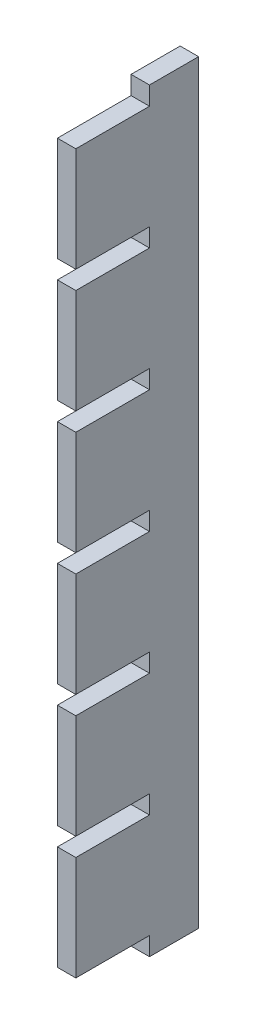
ISO-10303-21;
HEADER;
FILE_DESCRIPTION(('STEP AP214'),'2;1');
FILE_NAME('part.step','',(''),(''),'','','');
FILE_SCHEMA(('AUTOMOTIVE_DESIGN { 1 0 10303 214 1 1 1 1 }'));
ENDSEC;
DATA;
#1=APPLICATION_CONTEXT('core data for automotive mechanical design processes');
#2=APPLICATION_PROTOCOL_DEFINITION('international standard','automotive_design',2000,#1);
#3=PRODUCT_CONTEXT('',#1,'mechanical');
#4=PRODUCT('Part','Part','',(#3));
#5=PRODUCT_RELATED_PRODUCT_CATEGORY('part','',(#4));
#6=PRODUCT_DEFINITION_FORMATION('','',#4);
#7=PRODUCT_DEFINITION_CONTEXT('part definition',#1,'design');
#8=PRODUCT_DEFINITION('design','',#6,#7);
#9=PRODUCT_DEFINITION_SHAPE('','',#8);
#10=(LENGTH_UNIT() NAMED_UNIT(*) SI_UNIT(.MILLI.,.METRE.));
#11=(NAMED_UNIT(*) PLANE_ANGLE_UNIT() SI_UNIT($,.RADIAN.));
#12=(NAMED_UNIT(*) SI_UNIT($,.STERADIAN.) SOLID_ANGLE_UNIT());
#13=UNCERTAINTY_MEASURE_WITH_UNIT(LENGTH_MEASURE(1.E-05),#10,'distance_accuracy_value','');
#14=(GEOMETRIC_REPRESENTATION_CONTEXT(3) GLOBAL_UNCERTAINTY_ASSIGNED_CONTEXT((#13)) GLOBAL_UNIT_ASSIGNED_CONTEXT((#10,
#11,#12)) REPRESENTATION_CONTEXT('',''));
#15=CARTESIAN_POINT('',(0.,0.,0.));
#16=DIRECTION('',(0.,0.,1.));
#17=DIRECTION('',(1.,0.,0.));
#18=AXIS2_PLACEMENT_3D('',#15,#16,#17);
#19=CARTESIAN_POINT('',(3.,0.,0.));
#20=DIRECTION('',(0.,0.,-1.));
#21=DIRECTION('',(-1.,0.,0.));
#22=AXIS2_PLACEMENT_3D('',#19,#20,#21);
#23=PLANE('',#22);
#24=DIRECTION('',(0.,-1.,0.));
#25=VECTOR('',#24,1.);
#26=CARTESIAN_POINT('',(0.,0.,0.));
#27=LINE('',#26,#25);
#28=CARTESIAN_POINT('',(0.,40.,0.));
#29=VERTEX_POINT('',#28);
#30=CARTESIAN_POINT('',(0.,23.,0.));
#31=VERTEX_POINT('',#30);
#32=EDGE_CURVE('E255',#29,#31,#27,.T.);
#33=ORIENTED_EDGE('',*,*,#32,.T.);
#34=DIRECTION('',(1.,0.,0.));
#35=VECTOR('',#34,1.);
#36=CARTESIAN_POINT('',(0.,23.,0.));
#37=LINE('',#36,#35);
#38=CARTESIAN_POINT('',(3.,23.,0.));
#39=VERTEX_POINT('',#38);
#40=EDGE_CURVE('E476',#31,#39,#37,.T.);
#41=ORIENTED_EDGE('',*,*,#40,.T.);
#42=DIRECTION('',(0.,-1.,0.));
#43=VECTOR('',#42,1.);
#44=CARTESIAN_POINT('',(3.,0.,0.));
#45=LINE('',#44,#43);
#46=CARTESIAN_POINT('',(3.,40.,0.));
#47=VERTEX_POINT('',#46);
#48=EDGE_CURVE('E486',#47,#39,#45,.T.);
#49=ORIENTED_EDGE('',*,*,#48,.F.);
#50=DIRECTION('',(1.,0.,0.));
#51=VECTOR('',#50,1.);
#52=CARTESIAN_POINT('',(0.,40.,0.));
#53=LINE('',#52,#51);
#54=EDGE_CURVE('E310',#29,#47,#53,.T.);
#55=ORIENTED_EDGE('',*,*,#54,.F.);
#56=EDGE_LOOP('',(#33,#41,#49,#55));
#57=FACE_BOUND('',#56,.T.);
#58=ADVANCED_FACE('F43',(#57),#23,.F.);
#59=CARTESIAN_POINT('',(0.,60.,0.));
#60=VERTEX_POINT('',#59);
#61=CARTESIAN_POINT('',(0.,43.,0.));
#62=VERTEX_POINT('',#61);
#63=EDGE_CURVE('E262',#60,#62,#27,.T.);
#64=ORIENTED_EDGE('',*,*,#63,.T.);
#65=DIRECTION('',(1.,0.,0.));
#66=VECTOR('',#65,1.);
#67=CARTESIAN_POINT('',(0.,43.,0.));
#68=LINE('',#67,#66);
#69=CARTESIAN_POINT('',(3.,43.,0.));
#70=VERTEX_POINT('',#69);
#71=EDGE_CURVE('E298',#62,#70,#68,.T.);
#72=ORIENTED_EDGE('',*,*,#71,.T.);
#73=CARTESIAN_POINT('',(3.,60.,0.));
#74=VERTEX_POINT('',#73);
#75=EDGE_CURVE('E538',#74,#70,#45,.T.);
#76=ORIENTED_EDGE('',*,*,#75,.F.);
#77=DIRECTION('',(1.,0.,0.));
#78=VECTOR('',#77,1.);
#79=CARTESIAN_POINT('',(0.,60.,0.));
#80=LINE('',#79,#78);
#81=EDGE_CURVE('E300',#60,#74,#80,.T.);
#82=ORIENTED_EDGE('',*,*,#81,.F.);
#83=EDGE_LOOP('',(#64,#72,#76,#82));
#84=FACE_BOUND('',#83,.T.);
#85=ADVANCED_FACE('F296',(#84),#23,.F.);
#86=CARTESIAN_POINT('',(0.,80.,0.));
#87=VERTEX_POINT('',#86);
#88=CARTESIAN_POINT('',(0.,63.,0.));
#89=VERTEX_POINT('',#88);
#90=EDGE_CURVE('E279',#87,#89,#27,.T.);
#91=ORIENTED_EDGE('',*,*,#90,.T.);
#92=DIRECTION('',(1.,0.,0.));
#93=VECTOR('',#92,1.);
#94=CARTESIAN_POINT('',(0.,63.,0.));
#95=LINE('',#94,#93);
#96=CARTESIAN_POINT('',(3.,63.,0.));
#97=VERTEX_POINT('',#96);
#98=EDGE_CURVE('E325',#89,#97,#95,.T.);
#99=ORIENTED_EDGE('',*,*,#98,.T.);
#100=CARTESIAN_POINT('',(3.,80.,0.));
#101=VERTEX_POINT('',#100);
#102=EDGE_CURVE('E532',#101,#97,#45,.T.);
#103=ORIENTED_EDGE('',*,*,#102,.F.);
#104=DIRECTION('',(1.,0.,0.));
#105=VECTOR('',#104,1.);
#106=CARTESIAN_POINT('',(0.,80.,0.));
#107=LINE('',#106,#105);
#108=EDGE_CURVE('E384',#87,#101,#107,.T.);
#109=ORIENTED_EDGE('',*,*,#108,.F.);
#110=EDGE_LOOP('',(#91,#99,#103,#109));
#111=FACE_BOUND('',#110,.T.);
#112=ADVANCED_FACE('F587',(#111),#23,.F.);
#113=CARTESIAN_POINT('',(0.,100.,0.));
#114=VERTEX_POINT('',#113);
#115=CARTESIAN_POINT('',(0.,83.,0.));
#116=VERTEX_POINT('',#115);
#117=EDGE_CURVE('E270',#114,#116,#27,.T.);
#118=ORIENTED_EDGE('',*,*,#117,.T.);
#119=DIRECTION('',(1.,0.,0.));
#120=VECTOR('',#119,1.);
#121=CARTESIAN_POINT('',(0.,83.,0.));
#122=LINE('',#121,#120);
#123=CARTESIAN_POINT('',(3.,83.,0.));
#124=VERTEX_POINT('',#123);
#125=EDGE_CURVE('E355',#116,#124,#122,.T.);
#126=ORIENTED_EDGE('',*,*,#125,.T.);
#127=CARTESIAN_POINT('',(3.,100.,0.));
#128=VERTEX_POINT('',#127);
#129=EDGE_CURVE('E529',#128,#124,#45,.T.);
#130=ORIENTED_EDGE('',*,*,#129,.F.);
#131=DIRECTION('',(1.,0.,0.));
#132=VECTOR('',#131,1.);
#133=CARTESIAN_POINT('',(0.,100.,0.));
#134=LINE('',#133,#132);
#135=EDGE_CURVE('E419',#114,#128,#134,.T.);
#136=ORIENTED_EDGE('',*,*,#135,.F.);
#137=EDGE_LOOP('',(#118,#126,#130,#136));
#138=FACE_BOUND('',#137,.T.);
#139=ADVANCED_FACE('F595',(#138),#23,.F.);
#140=CARTESIAN_POINT('',(0.,120.,0.));
#141=VERTEX_POINT('',#140);
#142=CARTESIAN_POINT('',(0.,103.,0.));
#143=VERTEX_POINT('',#142);
#144=EDGE_CURVE('E258',#141,#143,#27,.T.);
#145=ORIENTED_EDGE('',*,*,#144,.T.);
#146=DIRECTION('',(1.,0.,0.));
#147=VECTOR('',#146,1.);
#148=CARTESIAN_POINT('',(0.,103.,0.));
#149=LINE('',#148,#147);
#150=CARTESIAN_POINT('',(3.,103.,0.));
#151=VERTEX_POINT('',#150);
#152=EDGE_CURVE('E390',#143,#151,#149,.T.);
#153=ORIENTED_EDGE('',*,*,#152,.T.);
#154=CARTESIAN_POINT('',(3.,120.,0.));
#155=VERTEX_POINT('',#154);
#156=EDGE_CURVE('E488',#155,#151,#45,.T.);
#157=ORIENTED_EDGE('',*,*,#156,.F.);
#158=DIRECTION('',(1.,0.,0.));
#159=VECTOR('',#158,1.);
#160=CARTESIAN_POINT('',(0.,120.,0.));
#161=LINE('',#160,#159);
#162=EDGE_CURVE('E450',#141,#155,#161,.T.);
#163=ORIENTED_EDGE('',*,*,#162,.F.);
#164=EDGE_LOOP('',(#145,#153,#157,#163));
#165=FACE_BOUND('',#164,.T.);
#166=ADVANCED_FACE('F527',(#165),#23,.F.);
#167=CARTESIAN_POINT('',(3.,20.,0.));
#168=VERTEX_POINT('',#167);
#169=CARTESIAN_POINT('',(3.,3.,0.));
#170=VERTEX_POINT('',#169);
#171=EDGE_CURVE('E245',#168,#170,#45,.T.);
#172=ORIENTED_EDGE('',*,*,#171,.F.);
#173=DIRECTION('',(1.,0.,0.));
#174=VECTOR('',#173,1.);
#175=CARTESIAN_POINT('',(0.,20.,0.));
#176=LINE('',#175,#174);
#177=CARTESIAN_POINT('',(0.,20.,0.));
#178=VERTEX_POINT('',#177);
#179=EDGE_CURVE('E232',#178,#168,#176,.T.);
#180=ORIENTED_EDGE('',*,*,#179,.F.);
#181=CARTESIAN_POINT('',(0.,3.,0.));
#182=VERTEX_POINT('',#181);
#183=EDGE_CURVE('E243',#178,#182,#27,.T.);
#184=ORIENTED_EDGE('',*,*,#183,.T.);
#185=DIRECTION('',(1.,0.,0.));
#186=VECTOR('',#185,1.);
#187=CARTESIAN_POINT('',(0.,3.,0.));
#188=LINE('',#187,#186);
#189=EDGE_CURVE('E256',#182,#170,#188,.T.);
#190=ORIENTED_EDGE('',*,*,#189,.T.);
#191=EDGE_LOOP('',(#172,#180,#184,#190));
#192=FACE_BOUND('',#191,.T.);
#193=ADVANCED_FACE('F45',(#192),#23,.F.);
#194=CARTESIAN_POINT('',(3.,0.,0.));
#195=DIRECTION('',(0.,1.,0.));
#196=DIRECTION('',(0.,0.,1.));
#197=AXIS2_PLACEMENT_3D('',#194,#195,#196);
#198=PLANE('',#197);
#199=DIRECTION('',(0.,0.,-1.));
#200=VECTOR('',#199,1.);
#201=CARTESIAN_POINT('',(3.,0.,0.));
#202=LINE('',#201,#200);
#203=CARTESIAN_POINT('',(3.,0.,-12.));
#204=VERTEX_POINT('',#203);
#205=CARTESIAN_POINT('',(3.,0.,-20.));
#206=VERTEX_POINT('',#205);
#207=EDGE_CURVE('E489',#204,#206,#202,.T.);
#208=ORIENTED_EDGE('',*,*,#207,.F.);
#209=DIRECTION('',(1.,0.,0.));
#210=VECTOR('',#209,1.);
#211=CARTESIAN_POINT('',(0.,0.,-12.));
#212=LINE('',#211,#210);
#213=CARTESIAN_POINT('',(0.,0.,-12.));
#214=VERTEX_POINT('',#213);
#215=EDGE_CURVE('E471',#214,#204,#212,.T.);
#216=ORIENTED_EDGE('',*,*,#215,.F.);
#217=DIRECTION('',(0.,0.,-1.));
#218=VECTOR('',#217,1.);
#219=CARTESIAN_POINT('',(0.,0.,0.));
#220=LINE('',#219,#218);
#221=CARTESIAN_POINT('',(0.,0.,-20.));
#222=VERTEX_POINT('',#221);
#223=EDGE_CURVE('E269',#214,#222,#220,.T.);
#224=ORIENTED_EDGE('',*,*,#223,.T.);
#225=DIRECTION('',(-1.,0.,0.));
#226=VECTOR('',#225,1.);
#227=CARTESIAN_POINT('',(3.,0.,-20.));
#228=LINE('',#227,#226);
#229=EDGE_CURVE('E11',#206,#222,#228,.T.);
#230=ORIENTED_EDGE('',*,*,#229,.F.);
#231=EDGE_LOOP('',(#208,#216,#224,#230));
#232=FACE_BOUND('',#231,.T.);
#233=ADVANCED_FACE('F589',(#232),#198,.F.);
#234=CARTESIAN_POINT('',(3.,0.,-20.));
#235=DIRECTION('',(0.,0.,1.));
#236=DIRECTION('',(1.,0.,0.));
#237=AXIS2_PLACEMENT_3D('',#234,#235,#236);
#238=PLANE('',#237);
#239=DIRECTION('',(0.,1.,0.));
#240=VECTOR('',#239,1.);
#241=CARTESIAN_POINT('',(0.,0.,-20.));
#242=LINE('',#241,#240);
#243=CARTESIAN_POINT('',(0.,123.,-20.));
#244=VERTEX_POINT('',#243);
#245=EDGE_CURVE('E277',#222,#244,#242,.T.);
#246=ORIENTED_EDGE('',*,*,#245,.T.);
#247=DIRECTION('',(-1.,0.,0.));
#248=VECTOR('',#247,1.);
#249=CARTESIAN_POINT('',(3.,123.,-20.));
#250=LINE('',#249,#248);
#251=CARTESIAN_POINT('',(3.,123.,-20.));
#252=VERTEX_POINT('',#251);
#253=EDGE_CURVE('E52',#252,#244,#250,.T.);
#254=ORIENTED_EDGE('',*,*,#253,.F.);
#255=DIRECTION('',(0.,1.,0.));
#256=VECTOR('',#255,1.);
#257=CARTESIAN_POINT('',(3.,0.,-20.));
#258=LINE('',#257,#256);
#259=EDGE_CURVE('E492',#206,#252,#258,.T.);
#260=ORIENTED_EDGE('',*,*,#259,.F.);
#261=ORIENTED_EDGE('',*,*,#229,.T.);
#262=EDGE_LOOP('',(#246,#254,#260,#261));
#263=FACE_BOUND('',#262,.T.);
#264=ADVANCED_FACE('F512',(#263),#238,.F.);
#265=CARTESIAN_POINT('',(3.,123.,0.));
#266=DIRECTION('',(0.,-1.,0.));
#267=DIRECTION('',(0.,0.,-1.));
#268=AXIS2_PLACEMENT_3D('',#265,#266,#267);
#269=PLANE('',#268);
#270=DIRECTION('',(0.,0.,1.));
#271=VECTOR('',#270,1.);
#272=CARTESIAN_POINT('',(0.,123.,0.));
#273=LINE('',#272,#271);
#274=CARTESIAN_POINT('',(0.,123.,-12.));
#275=VERTEX_POINT('',#274);
#276=EDGE_CURVE('E487',#244,#275,#273,.T.);
#277=ORIENTED_EDGE('',*,*,#276,.T.);
#278=DIRECTION('',(1.,0.,0.));
#279=VECTOR('',#278,1.);
#280=CARTESIAN_POINT('',(0.,123.,-12.));
#281=LINE('',#280,#279);
#282=CARTESIAN_POINT('',(3.,123.,-12.));
#283=VERTEX_POINT('',#282);
#284=EDGE_CURVE('E425',#275,#283,#281,.T.);
#285=ORIENTED_EDGE('',*,*,#284,.T.);
#286=DIRECTION('',(0.,0.,1.));
#287=VECTOR('',#286,1.);
#288=CARTESIAN_POINT('',(3.,123.,0.));
#289=LINE('',#288,#287);
#290=EDGE_CURVE('E494',#252,#283,#289,.T.);
#291=ORIENTED_EDGE('',*,*,#290,.F.);
#292=ORIENTED_EDGE('',*,*,#253,.T.);
#293=EDGE_LOOP('',(#277,#285,#291,#292));
#294=FACE_BOUND('',#293,.T.);
#295=ADVANCED_FACE('F516',(#294),#269,.F.);
#296=CARTESIAN_POINT('',(3.,0.,0.));
#297=DIRECTION('',(-1.,0.,0.));
#298=DIRECTION('',(0.,0.,1.));
#299=AXIS2_PLACEMENT_3D('',#296,#297,#298);
#300=PLANE('',#299);
#301=ORIENTED_EDGE('',*,*,#48,.T.);
#302=DIRECTION('',(0.,0.,1.));
#303=VECTOR('',#302,1.);
#304=CARTESIAN_POINT('',(3.,23.,0.));
#305=LINE('',#304,#303);
#306=CARTESIAN_POINT('',(3.,23.,-12.));
#307=VERTEX_POINT('',#306);
#308=EDGE_CURVE('E238',#307,#39,#305,.T.);
#309=ORIENTED_EDGE('',*,*,#308,.F.);
#310=DIRECTION('',(0.,1.,0.));
#311=VECTOR('',#310,1.);
#312=CARTESIAN_POINT('',(3.,20.,-12.));
#313=LINE('',#312,#311);
#314=CARTESIAN_POINT('',(3.,20.,-12.));
#315=VERTEX_POINT('',#314);
#316=EDGE_CURVE('E857',#315,#307,#313,.T.);
#317=ORIENTED_EDGE('',*,*,#316,.F.);
#318=DIRECTION('',(0.,0.,-1.));
#319=VECTOR('',#318,1.);
#320=CARTESIAN_POINT('',(3.,20.,0.));
#321=LINE('',#320,#319);
#322=EDGE_CURVE('E334',#168,#315,#321,.T.);
#323=ORIENTED_EDGE('',*,*,#322,.F.);
#324=ORIENTED_EDGE('',*,*,#171,.T.);
#325=DIRECTION('',(0.,0.,1.));
#326=VECTOR('',#325,1.);
#327=CARTESIAN_POINT('',(3.,3.,0.));
#328=LINE('',#327,#326);
#329=CARTESIAN_POINT('',(3.,3.,-12.));
#330=VERTEX_POINT('',#329);
#331=EDGE_CURVE('E468',#330,#170,#328,.T.);
#332=ORIENTED_EDGE('',*,*,#331,.F.);
#333=DIRECTION('',(0.,1.,0.));
#334=VECTOR('',#333,1.);
#335=CARTESIAN_POINT('',(3.,0.,-12.));
#336=LINE('',#335,#334);
#337=EDGE_CURVE('E472',#204,#330,#336,.T.);
#338=ORIENTED_EDGE('',*,*,#337,.F.);
#339=ORIENTED_EDGE('',*,*,#207,.T.);
#340=ORIENTED_EDGE('',*,*,#259,.T.);
#341=ORIENTED_EDGE('',*,*,#290,.T.);
#342=DIRECTION('',(0.,1.,0.));
#343=VECTOR('',#342,1.);
#344=CARTESIAN_POINT('',(3.,120.,-12.));
#345=LINE('',#344,#343);
#346=CARTESIAN_POINT('',(3.,120.,-12.));
#347=VERTEX_POINT('',#346);
#348=EDGE_CURVE('E446',#347,#283,#345,.T.);
#349=ORIENTED_EDGE('',*,*,#348,.F.);
#350=DIRECTION('',(0.,0.,-1.));
#351=VECTOR('',#350,1.);
#352=CARTESIAN_POINT('',(3.,120.,0.));
#353=LINE('',#352,#351);
#354=EDGE_CURVE('E451',#155,#347,#353,.T.);
#355=ORIENTED_EDGE('',*,*,#354,.F.);
#356=ORIENTED_EDGE('',*,*,#156,.T.);
#357=DIRECTION('',(0.,0.,1.));
#358=VECTOR('',#357,1.);
#359=CARTESIAN_POINT('',(3.,103.,0.));
#360=LINE('',#359,#358);
#361=CARTESIAN_POINT('',(3.,103.,-12.));
#362=VERTEX_POINT('',#361);
#363=EDGE_CURVE('E411',#362,#151,#360,.T.);
#364=ORIENTED_EDGE('',*,*,#363,.F.);
#365=DIRECTION('',(0.,1.,0.));
#366=VECTOR('',#365,1.);
#367=CARTESIAN_POINT('',(3.,100.,-12.));
#368=LINE('',#367,#366);
#369=CARTESIAN_POINT('',(3.,100.,-12.));
#370=VERTEX_POINT('',#369);
#371=EDGE_CURVE('E424',#370,#362,#368,.T.);
#372=ORIENTED_EDGE('',*,*,#371,.F.);
#373=DIRECTION('',(0.,0.,-1.));
#374=VECTOR('',#373,1.);
#375=CARTESIAN_POINT('',(3.,100.,0.));
#376=LINE('',#375,#374);
#377=EDGE_CURVE('E420',#128,#370,#376,.T.);
#378=ORIENTED_EDGE('',*,*,#377,.F.);
#379=ORIENTED_EDGE('',*,*,#129,.T.);
#380=DIRECTION('',(0.,0.,1.));
#381=VECTOR('',#380,1.);
#382=CARTESIAN_POINT('',(3.,83.,0.));
#383=LINE('',#382,#381);
#384=CARTESIAN_POINT('',(3.,83.,-12.));
#385=VERTEX_POINT('',#384);
#386=EDGE_CURVE('E376',#385,#124,#383,.T.);
#387=ORIENTED_EDGE('',*,*,#386,.F.);
#388=DIRECTION('',(0.,1.,0.));
#389=VECTOR('',#388,1.);
#390=CARTESIAN_POINT('',(3.,80.,-12.));
#391=LINE('',#390,#389);
#392=CARTESIAN_POINT('',(3.,80.,-12.));
#393=VERTEX_POINT('',#392);
#394=EDGE_CURVE('E389',#393,#385,#391,.T.);
#395=ORIENTED_EDGE('',*,*,#394,.F.);
#396=DIRECTION('',(0.,0.,-1.));
#397=VECTOR('',#396,1.);
#398=CARTESIAN_POINT('',(3.,80.,0.));
#399=LINE('',#398,#397);
#400=EDGE_CURVE('E385',#101,#393,#399,.T.);
#401=ORIENTED_EDGE('',*,*,#400,.F.);
#402=ORIENTED_EDGE('',*,*,#102,.T.);
#403=DIRECTION('',(0.,0.,1.));
#404=VECTOR('',#403,1.);
#405=CARTESIAN_POINT('',(3.,63.,0.));
#406=LINE('',#405,#404);
#407=CARTESIAN_POINT('',(3.,63.,-12.));
#408=VERTEX_POINT('',#407);
#409=EDGE_CURVE('E343',#408,#97,#406,.T.);
#410=ORIENTED_EDGE('',*,*,#409,.F.);
#411=DIRECTION('',(0.,1.,0.));
#412=VECTOR('',#411,1.);
#413=CARTESIAN_POINT('',(3.,60.,-12.));
#414=LINE('',#413,#412);
#415=CARTESIAN_POINT('',(3.,60.,-12.));
#416=VERTEX_POINT('',#415);
#417=EDGE_CURVE('E354',#416,#408,#414,.T.);
#418=ORIENTED_EDGE('',*,*,#417,.F.);
#419=DIRECTION('',(0.,0.,-1.));
#420=VECTOR('',#419,1.);
#421=CARTESIAN_POINT('',(3.,60.,0.));
#422=LINE('',#421,#420);
#423=EDGE_CURVE('E350',#74,#416,#422,.T.);
#424=ORIENTED_EDGE('',*,*,#423,.F.);
#425=ORIENTED_EDGE('',*,*,#75,.T.);
#426=DIRECTION('',(0.,0.,1.));
#427=VECTOR('',#426,1.);
#428=CARTESIAN_POINT('',(3.,43.,0.));
#429=LINE('',#428,#427);
#430=CARTESIAN_POINT('',(3.,43.,-12.));
#431=VERTEX_POINT('',#430);
#432=EDGE_CURVE('E329',#431,#70,#429,.T.);
#433=ORIENTED_EDGE('',*,*,#432,.F.);
#434=DIRECTION('',(0.,1.,0.));
#435=VECTOR('',#434,1.);
#436=CARTESIAN_POINT('',(3.,40.,-12.));
#437=LINE('',#436,#435);
#438=CARTESIAN_POINT('',(3.,40.,-12.));
#439=VERTEX_POINT('',#438);
#440=EDGE_CURVE('E324',#439,#431,#437,.T.);
#441=ORIENTED_EDGE('',*,*,#440,.F.);
#442=DIRECTION('',(0.,0.,-1.));
#443=VECTOR('',#442,1.);
#444=CARTESIAN_POINT('',(3.,40.,0.));
#445=LINE('',#444,#443);
#446=EDGE_CURVE('E320',#47,#439,#445,.T.);
#447=ORIENTED_EDGE('',*,*,#446,.F.);
#448=EDGE_LOOP('',(#301,#309,#317,#323,#324,#332,#338,#339,#340,#341,#349,#355,#356,#364,#372,
#378,#379,#387,#395,#401,#402,#410,#418,#424,#425,#433,#441,#447));
#449=FACE_BOUND('',#448,.T.);
#450=ADVANCED_FACE('F522',(#449),#300,.F.);
#451=CARTESIAN_POINT('',(0.,0.,0.));
#452=DIRECTION('',(-1.,0.,0.));
#453=DIRECTION('',(0.,0.,1.));
#454=AXIS2_PLACEMENT_3D('',#451,#452,#453);
#455=PLANE('',#454);
#456=DIRECTION('',(0.,0.,1.));
#457=VECTOR('',#456,1.);
#458=CARTESIAN_POINT('',(0.,23.,0.));
#459=LINE('',#458,#457);
#460=CARTESIAN_POINT('',(0.,23.,-12.));
#461=VERTEX_POINT('',#460);
#462=EDGE_CURVE('E247',#461,#31,#459,.T.);
#463=ORIENTED_EDGE('',*,*,#462,.T.);
#464=ORIENTED_EDGE('',*,*,#32,.F.);
#465=DIRECTION('',(0.,0.,-1.));
#466=VECTOR('',#465,1.);
#467=CARTESIAN_POINT('',(0.,40.,0.));
#468=LINE('',#467,#466);
#469=CARTESIAN_POINT('',(0.,40.,-12.));
#470=VERTEX_POINT('',#469);
#471=EDGE_CURVE('E316',#29,#470,#468,.T.);
#472=ORIENTED_EDGE('',*,*,#471,.T.);
#473=DIRECTION('',(0.,1.,0.));
#474=VECTOR('',#473,1.);
#475=CARTESIAN_POINT('',(0.,40.,-12.));
#476=LINE('',#475,#474);
#477=CARTESIAN_POINT('',(0.,43.,-12.));
#478=VERTEX_POINT('',#477);
#479=EDGE_CURVE('E67',#470,#478,#476,.T.);
#480=ORIENTED_EDGE('',*,*,#479,.T.);
#481=DIRECTION('',(0.,0.,1.));
#482=VECTOR('',#481,1.);
#483=CARTESIAN_POINT('',(0.,43.,0.));
#484=LINE('',#483,#482);
#485=EDGE_CURVE('E306',#478,#62,#484,.T.);
#486=ORIENTED_EDGE('',*,*,#485,.T.);
#487=ORIENTED_EDGE('',*,*,#63,.F.);
#488=DIRECTION('',(0.,0.,-1.));
#489=VECTOR('',#488,1.);
#490=CARTESIAN_POINT('',(0.,60.,0.));
#491=LINE('',#490,#489);
#492=CARTESIAN_POINT('',(0.,60.,-12.));
#493=VERTEX_POINT('',#492);
#494=EDGE_CURVE('E304',#60,#493,#491,.T.);
#495=ORIENTED_EDGE('',*,*,#494,.T.);
#496=DIRECTION('',(0.,1.,0.));
#497=VECTOR('',#496,1.);
#498=CARTESIAN_POINT('',(0.,60.,-12.));
#499=LINE('',#498,#497);
#500=CARTESIAN_POINT('',(0.,63.,-12.));
#501=VERTEX_POINT('',#500);
#502=EDGE_CURVE('E342',#493,#501,#499,.T.);
#503=ORIENTED_EDGE('',*,*,#502,.T.);
#504=DIRECTION('',(0.,0.,1.));
#505=VECTOR('',#504,1.);
#506=CARTESIAN_POINT('',(0.,63.,0.));
#507=LINE('',#506,#505);
#508=EDGE_CURVE('E346',#501,#89,#507,.T.);
#509=ORIENTED_EDGE('',*,*,#508,.T.);
#510=ORIENTED_EDGE('',*,*,#90,.F.);
#511=DIRECTION('',(0.,0.,-1.));
#512=VECTOR('',#511,1.);
#513=CARTESIAN_POINT('',(0.,80.,0.));
#514=LINE('',#513,#512);
#515=CARTESIAN_POINT('',(0.,80.,-12.));
#516=VERTEX_POINT('',#515);
#517=EDGE_CURVE('E371',#87,#516,#514,.T.);
#518=ORIENTED_EDGE('',*,*,#517,.T.);
#519=DIRECTION('',(0.,1.,0.));
#520=VECTOR('',#519,1.);
#521=CARTESIAN_POINT('',(0.,80.,-12.));
#522=LINE('',#521,#520);
#523=CARTESIAN_POINT('',(0.,83.,-12.));
#524=VERTEX_POINT('',#523);
#525=EDGE_CURVE('E375',#516,#524,#522,.T.);
#526=ORIENTED_EDGE('',*,*,#525,.T.);
#527=DIRECTION('',(0.,0.,1.));
#528=VECTOR('',#527,1.);
#529=CARTESIAN_POINT('',(0.,83.,0.));
#530=LINE('',#529,#528);
#531=EDGE_CURVE('E380',#524,#116,#530,.T.);
#532=ORIENTED_EDGE('',*,*,#531,.T.);
#533=ORIENTED_EDGE('',*,*,#117,.F.);
#534=DIRECTION('',(0.,0.,-1.));
#535=VECTOR('',#534,1.);
#536=CARTESIAN_POINT('',(0.,100.,0.));
#537=LINE('',#536,#535);
#538=CARTESIAN_POINT('',(0.,100.,-12.));
#539=VERTEX_POINT('',#538);
#540=EDGE_CURVE('E406',#114,#539,#537,.T.);
#541=ORIENTED_EDGE('',*,*,#540,.T.);
#542=DIRECTION('',(0.,1.,0.));
#543=VECTOR('',#542,1.);
#544=CARTESIAN_POINT('',(0.,100.,-12.));
#545=LINE('',#544,#543);
#546=CARTESIAN_POINT('',(0.,103.,-12.));
#547=VERTEX_POINT('',#546);
#548=EDGE_CURVE('E410',#539,#547,#545,.T.);
#549=ORIENTED_EDGE('',*,*,#548,.T.);
#550=DIRECTION('',(0.,0.,1.));
#551=VECTOR('',#550,1.);
#552=CARTESIAN_POINT('',(0.,103.,0.));
#553=LINE('',#552,#551);
#554=EDGE_CURVE('E415',#547,#143,#553,.T.);
#555=ORIENTED_EDGE('',*,*,#554,.T.);
#556=ORIENTED_EDGE('',*,*,#144,.F.);
#557=DIRECTION('',(0.,0.,-1.));
#558=VECTOR('',#557,1.);
#559=CARTESIAN_POINT('',(0.,120.,0.));
#560=LINE('',#559,#558);
#561=CARTESIAN_POINT('',(0.,120.,-12.));
#562=VERTEX_POINT('',#561);
#563=EDGE_CURVE('E441',#141,#562,#560,.T.);
#564=ORIENTED_EDGE('',*,*,#563,.T.);
#565=DIRECTION('',(0.,1.,0.));
#566=VECTOR('',#565,1.);
#567=CARTESIAN_POINT('',(0.,120.,-12.));
#568=LINE('',#567,#566);
#569=EDGE_CURVE('E445',#562,#275,#568,.T.);
#570=ORIENTED_EDGE('',*,*,#569,.T.);
#571=ORIENTED_EDGE('',*,*,#276,.F.);
#572=ORIENTED_EDGE('',*,*,#245,.F.);
#573=ORIENTED_EDGE('',*,*,#223,.F.);
#574=DIRECTION('',(0.,1.,0.));
#575=VECTOR('',#574,1.);
#576=CARTESIAN_POINT('',(0.,0.,-12.));
#577=LINE('',#576,#575);
#578=CARTESIAN_POINT('',(0.,3.,-12.));
#579=VERTEX_POINT('',#578);
#580=EDGE_CURVE('E465',#214,#579,#577,.T.);
#581=ORIENTED_EDGE('',*,*,#580,.T.);
#582=DIRECTION('',(0.,0.,1.));
#583=VECTOR('',#582,1.);
#584=CARTESIAN_POINT('',(0.,3.,0.));
#585=LINE('',#584,#583);
#586=EDGE_CURVE('E253',#579,#182,#585,.T.);
#587=ORIENTED_EDGE('',*,*,#586,.T.);
#588=ORIENTED_EDGE('',*,*,#183,.F.);
#589=DIRECTION('',(0.,0.,-1.));
#590=VECTOR('',#589,1.);
#591=CARTESIAN_POINT('',(0.,20.,0.));
#592=LINE('',#591,#590);
#593=CARTESIAN_POINT('',(0.,20.,-12.));
#594=VERTEX_POINT('',#593);
#595=EDGE_CURVE('E228',#178,#594,#592,.T.);
#596=ORIENTED_EDGE('',*,*,#595,.T.);
#597=DIRECTION('',(0.,1.,0.));
#598=VECTOR('',#597,1.);
#599=CARTESIAN_POINT('',(0.,20.,-12.));
#600=LINE('',#599,#598);
#601=EDGE_CURVE('E59',#594,#461,#600,.T.);
#602=ORIENTED_EDGE('',*,*,#601,.T.);
#603=EDGE_LOOP('',(#463,#464,#472,#480,#486,#487,#495,#503,#509,#510,#518,#526,#532,#533,#541,
#549,#555,#556,#564,#570,#571,#572,#573,#581,#587,#588,#596,#602));
#604=FACE_BOUND('',#603,.T.);
#605=ADVANCED_FACE('F251',(#604),#455,.T.);
#606=CARTESIAN_POINT('',(0.,3.,0.));
#607=DIRECTION('',(0.,1.,0.));
#608=DIRECTION('',(0.,0.,1.));
#609=AXIS2_PLACEMENT_3D('',#606,#607,#608);
#610=PLANE('',#609);
#611=ORIENTED_EDGE('',*,*,#331,.T.);
#612=ORIENTED_EDGE('',*,*,#189,.F.);
#613=ORIENTED_EDGE('',*,*,#586,.F.);
#614=DIRECTION('',(1.,0.,0.));
#615=VECTOR('',#614,1.);
#616=CARTESIAN_POINT('',(0.,3.,-12.));
#617=LINE('',#616,#615);
#618=EDGE_CURVE('E263',#579,#330,#617,.T.);
#619=ORIENTED_EDGE('',*,*,#618,.T.);
#620=EDGE_LOOP('',(#611,#612,#613,#619));
#621=FACE_BOUND('',#620,.T.);
#622=ADVANCED_FACE('F623',(#621),#610,.F.);
#623=CARTESIAN_POINT('',(0.,0.,-12.));
#624=DIRECTION('',(0.,0.,-1.));
#625=DIRECTION('',(-1.,0.,0.));
#626=AXIS2_PLACEMENT_3D('',#623,#624,#625);
#627=PLANE('',#626);
#628=ORIENTED_EDGE('',*,*,#337,.T.);
#629=ORIENTED_EDGE('',*,*,#618,.F.);
#630=ORIENTED_EDGE('',*,*,#580,.F.);
#631=ORIENTED_EDGE('',*,*,#215,.T.);
#632=EDGE_LOOP('',(#628,#629,#630,#631));
#633=FACE_BOUND('',#632,.T.);
#634=ADVANCED_FACE('F618',(#633),#627,.F.);
#635=CARTESIAN_POINT('',(0.,120.,-12.));
#636=DIRECTION('',(0.,0.,-1.));
#637=DIRECTION('',(-1.,0.,0.));
#638=AXIS2_PLACEMENT_3D('',#635,#636,#637);
#639=PLANE('',#638);
#640=ORIENTED_EDGE('',*,*,#348,.T.);
#641=ORIENTED_EDGE('',*,*,#284,.F.);
#642=ORIENTED_EDGE('',*,*,#569,.F.);
#643=DIRECTION('',(1.,0.,0.));
#644=VECTOR('',#643,1.);
#645=CARTESIAN_POINT('',(0.,120.,-12.));
#646=LINE('',#645,#644);
#647=EDGE_CURVE('E460',#562,#347,#646,.T.);
#648=ORIENTED_EDGE('',*,*,#647,.T.);
#649=EDGE_LOOP('',(#640,#641,#642,#648));
#650=FACE_BOUND('',#649,.T.);
#651=ADVANCED_FACE('F518',(#650),#639,.F.);
#652=CARTESIAN_POINT('',(0.,120.,0.));
#653=DIRECTION('',(0.,-1.,0.));
#654=DIRECTION('',(0.,0.,-1.));
#655=AXIS2_PLACEMENT_3D('',#652,#653,#654);
#656=PLANE('',#655);
#657=ORIENTED_EDGE('',*,*,#354,.T.);
#658=ORIENTED_EDGE('',*,*,#647,.F.);
#659=ORIENTED_EDGE('',*,*,#563,.F.);
#660=ORIENTED_EDGE('',*,*,#162,.T.);
#661=EDGE_LOOP('',(#657,#658,#659,#660));
#662=FACE_BOUND('',#661,.T.);
#663=ADVANCED_FACE('F683',(#662),#656,.F.);
#664=CARTESIAN_POINT('',(0.,103.,0.));
#665=DIRECTION('',(0.,1.,0.));
#666=DIRECTION('',(0.,0.,1.));
#667=AXIS2_PLACEMENT_3D('',#664,#665,#666);
#668=PLANE('',#667);
#669=ORIENTED_EDGE('',*,*,#363,.T.);
#670=ORIENTED_EDGE('',*,*,#152,.F.);
#671=ORIENTED_EDGE('',*,*,#554,.F.);
#672=DIRECTION('',(1.,0.,0.));
#673=VECTOR('',#672,1.);
#674=CARTESIAN_POINT('',(0.,103.,-12.));
#675=LINE('',#674,#673);
#676=EDGE_CURVE('E433',#547,#362,#675,.T.);
#677=ORIENTED_EDGE('',*,*,#676,.T.);
#678=EDGE_LOOP('',(#669,#670,#671,#677));
#679=FACE_BOUND('',#678,.T.);
#680=ADVANCED_FACE('F692',(#679),#668,.F.);
#681=CARTESIAN_POINT('',(0.,100.,-12.));
#682=DIRECTION('',(0.,0.,-1.));
#683=DIRECTION('',(-1.,0.,0.));
#684=AXIS2_PLACEMENT_3D('',#681,#682,#683);
#685=PLANE('',#684);
#686=ORIENTED_EDGE('',*,*,#371,.T.);
#687=ORIENTED_EDGE('',*,*,#676,.F.);
#688=ORIENTED_EDGE('',*,*,#548,.F.);
#689=DIRECTION('',(1.,0.,0.));
#690=VECTOR('',#689,1.);
#691=CARTESIAN_POINT('',(0.,100.,-12.));
#692=LINE('',#691,#690);
#693=EDGE_CURVE('E436',#539,#370,#692,.T.);
#694=ORIENTED_EDGE('',*,*,#693,.T.);
#695=EDGE_LOOP('',(#686,#687,#688,#694));
#696=FACE_BOUND('',#695,.T.);
#697=ADVANCED_FACE('F702',(#696),#685,.F.);
#698=CARTESIAN_POINT('',(0.,100.,0.));
#699=DIRECTION('',(0.,-1.,0.));
#700=DIRECTION('',(0.,0.,-1.));
#701=AXIS2_PLACEMENT_3D('',#698,#699,#700);
#702=PLANE('',#701);
#703=ORIENTED_EDGE('',*,*,#377,.T.);
#704=ORIENTED_EDGE('',*,*,#693,.F.);
#705=ORIENTED_EDGE('',*,*,#540,.F.);
#706=ORIENTED_EDGE('',*,*,#135,.T.);
#707=EDGE_LOOP('',(#703,#704,#705,#706));
#708=FACE_BOUND('',#707,.T.);
#709=ADVANCED_FACE('F713',(#708),#702,.F.);
#710=CARTESIAN_POINT('',(0.,83.,0.));
#711=DIRECTION('',(0.,1.,0.));
#712=DIRECTION('',(0.,0.,1.));
#713=AXIS2_PLACEMENT_3D('',#710,#711,#712);
#714=PLANE('',#713);
#715=ORIENTED_EDGE('',*,*,#386,.T.);
#716=ORIENTED_EDGE('',*,*,#125,.F.);
#717=ORIENTED_EDGE('',*,*,#531,.F.);
#718=DIRECTION('',(1.,0.,0.));
#719=VECTOR('',#718,1.);
#720=CARTESIAN_POINT('',(0.,83.,-12.));
#721=LINE('',#720,#719);
#722=EDGE_CURVE('E398',#524,#385,#721,.T.);
#723=ORIENTED_EDGE('',*,*,#722,.T.);
#724=EDGE_LOOP('',(#715,#716,#717,#723));
#725=FACE_BOUND('',#724,.T.);
#726=ADVANCED_FACE('F724',(#725),#714,.F.);
#727=CARTESIAN_POINT('',(0.,80.,-12.));
#728=DIRECTION('',(0.,0.,-1.));
#729=DIRECTION('',(-1.,0.,0.));
#730=AXIS2_PLACEMENT_3D('',#727,#728,#729);
#731=PLANE('',#730);
#732=ORIENTED_EDGE('',*,*,#394,.T.);
#733=ORIENTED_EDGE('',*,*,#722,.F.);
#734=ORIENTED_EDGE('',*,*,#525,.F.);
#735=DIRECTION('',(1.,0.,0.));
#736=VECTOR('',#735,1.);
#737=CARTESIAN_POINT('',(0.,80.,-12.));
#738=LINE('',#737,#736);
#739=EDGE_CURVE('E401',#516,#393,#738,.T.);
#740=ORIENTED_EDGE('',*,*,#739,.T.);
#741=EDGE_LOOP('',(#732,#733,#734,#740));
#742=FACE_BOUND('',#741,.T.);
#743=ADVANCED_FACE('F735',(#742),#731,.F.);
#744=CARTESIAN_POINT('',(0.,80.,0.));
#745=DIRECTION('',(0.,-1.,0.));
#746=DIRECTION('',(0.,0.,-1.));
#747=AXIS2_PLACEMENT_3D('',#744,#745,#746);
#748=PLANE('',#747);
#749=ORIENTED_EDGE('',*,*,#400,.T.);
#750=ORIENTED_EDGE('',*,*,#739,.F.);
#751=ORIENTED_EDGE('',*,*,#517,.F.);
#752=ORIENTED_EDGE('',*,*,#108,.T.);
#753=EDGE_LOOP('',(#749,#750,#751,#752));
#754=FACE_BOUND('',#753,.T.);
#755=ADVANCED_FACE('F746',(#754),#748,.F.);
#756=CARTESIAN_POINT('',(0.,63.,0.));
#757=DIRECTION('',(0.,1.,0.));
#758=DIRECTION('',(0.,0.,1.));
#759=AXIS2_PLACEMENT_3D('',#756,#757,#758);
#760=PLANE('',#759);
#761=ORIENTED_EDGE('',*,*,#409,.T.);
#762=ORIENTED_EDGE('',*,*,#98,.F.);
#763=ORIENTED_EDGE('',*,*,#508,.F.);
#764=DIRECTION('',(1.,0.,0.));
#765=VECTOR('',#764,1.);
#766=CARTESIAN_POINT('',(0.,63.,-12.));
#767=LINE('',#766,#765);
#768=EDGE_CURVE('E363',#501,#408,#767,.T.);
#769=ORIENTED_EDGE('',*,*,#768,.T.);
#770=EDGE_LOOP('',(#761,#762,#763,#769));
#771=FACE_BOUND('',#770,.T.);
#772=ADVANCED_FACE('F757',(#771),#760,.F.);
#773=CARTESIAN_POINT('',(0.,60.,-12.));
#774=DIRECTION('',(0.,0.,-1.));
#775=DIRECTION('',(-1.,0.,0.));
#776=AXIS2_PLACEMENT_3D('',#773,#774,#775);
#777=PLANE('',#776);
#778=ORIENTED_EDGE('',*,*,#417,.T.);
#779=ORIENTED_EDGE('',*,*,#768,.F.);
#780=ORIENTED_EDGE('',*,*,#502,.F.);
#781=DIRECTION('',(1.,0.,0.));
#782=VECTOR('',#781,1.);
#783=CARTESIAN_POINT('',(0.,60.,-12.));
#784=LINE('',#783,#782);
#785=EDGE_CURVE('E366',#493,#416,#784,.T.);
#786=ORIENTED_EDGE('',*,*,#785,.T.);
#787=EDGE_LOOP('',(#778,#779,#780,#786));
#788=FACE_BOUND('',#787,.T.);
#789=ADVANCED_FACE('F579',(#788),#777,.F.);
#790=CARTESIAN_POINT('',(0.,60.,0.));
#791=DIRECTION('',(0.,-1.,0.));
#792=DIRECTION('',(0.,0.,-1.));
#793=AXIS2_PLACEMENT_3D('',#790,#791,#792);
#794=PLANE('',#793);
#795=ORIENTED_EDGE('',*,*,#423,.T.);
#796=ORIENTED_EDGE('',*,*,#785,.F.);
#797=ORIENTED_EDGE('',*,*,#494,.F.);
#798=ORIENTED_EDGE('',*,*,#81,.T.);
#799=EDGE_LOOP('',(#795,#796,#797,#798));
#800=FACE_BOUND('',#799,.T.);
#801=ADVANCED_FACE('F572',(#800),#794,.F.);
#802=CARTESIAN_POINT('',(0.,43.,0.));
#803=DIRECTION('',(0.,1.,0.));
#804=DIRECTION('',(0.,0.,1.));
#805=AXIS2_PLACEMENT_3D('',#802,#803,#804);
#806=PLANE('',#805);
#807=ORIENTED_EDGE('',*,*,#432,.T.);
#808=ORIENTED_EDGE('',*,*,#71,.F.);
#809=ORIENTED_EDGE('',*,*,#485,.F.);
#810=DIRECTION('',(1.,0.,0.));
#811=VECTOR('',#810,1.);
#812=CARTESIAN_POINT('',(0.,43.,-12.));
#813=LINE('',#812,#811);
#814=EDGE_CURVE('E335',#478,#431,#813,.T.);
#815=ORIENTED_EDGE('',*,*,#814,.T.);
#816=EDGE_LOOP('',(#807,#808,#809,#815));
#817=FACE_BOUND('',#816,.T.);
#818=ADVANCED_FACE('F570',(#817),#806,.F.);
#819=CARTESIAN_POINT('',(0.,40.,-12.));
#820=DIRECTION('',(0.,0.,-1.));
#821=DIRECTION('',(-1.,0.,0.));
#822=AXIS2_PLACEMENT_3D('',#819,#820,#821);
#823=PLANE('',#822);
#824=ORIENTED_EDGE('',*,*,#440,.T.);
#825=ORIENTED_EDGE('',*,*,#814,.F.);
#826=ORIENTED_EDGE('',*,*,#479,.F.);
#827=DIRECTION('',(1.,0.,0.));
#828=VECTOR('',#827,1.);
#829=CARTESIAN_POINT('',(0.,40.,-12.));
#830=LINE('',#829,#828);
#831=EDGE_CURVE('E314',#470,#439,#830,.T.);
#832=ORIENTED_EDGE('',*,*,#831,.T.);
#833=EDGE_LOOP('',(#824,#825,#826,#832));
#834=FACE_BOUND('',#833,.T.);
#835=ADVANCED_FACE('F569',(#834),#823,.F.);
#836=CARTESIAN_POINT('',(0.,40.,0.));
#837=DIRECTION('',(0.,-1.,0.));
#838=DIRECTION('',(0.,0.,-1.));
#839=AXIS2_PLACEMENT_3D('',#836,#837,#838);
#840=PLANE('',#839);
#841=ORIENTED_EDGE('',*,*,#446,.T.);
#842=ORIENTED_EDGE('',*,*,#831,.F.);
#843=ORIENTED_EDGE('',*,*,#471,.F.);
#844=ORIENTED_EDGE('',*,*,#54,.T.);
#845=EDGE_LOOP('',(#841,#842,#843,#844));
#846=FACE_BOUND('',#845,.T.);
#847=ADVANCED_FACE('F568',(#846),#840,.F.);
#848=CARTESIAN_POINT('',(0.,23.,0.));
#849=DIRECTION('',(0.,1.,0.));
#850=DIRECTION('',(0.,0.,1.));
#851=AXIS2_PLACEMENT_3D('',#848,#849,#850);
#852=PLANE('',#851);
#853=ORIENTED_EDGE('',*,*,#308,.T.);
#854=ORIENTED_EDGE('',*,*,#40,.F.);
#855=ORIENTED_EDGE('',*,*,#462,.F.);
#856=DIRECTION('',(1.,0.,0.));
#857=VECTOR('',#856,1.);
#858=CARTESIAN_POINT('',(0.,23.,-12.));
#859=LINE('',#858,#857);
#860=EDGE_CURVE('E558',#461,#307,#859,.T.);
#861=ORIENTED_EDGE('',*,*,#860,.T.);
#862=EDGE_LOOP('',(#853,#854,#855,#861));
#863=FACE_BOUND('',#862,.T.);
#864=ADVANCED_FACE('F807',(#863),#852,.F.);
#865=CARTESIAN_POINT('',(0.,20.,-12.));
#866=DIRECTION('',(0.,0.,-1.));
#867=DIRECTION('',(-1.,0.,0.));
#868=AXIS2_PLACEMENT_3D('',#865,#866,#867);
#869=PLANE('',#868);
#870=ORIENTED_EDGE('',*,*,#316,.T.);
#871=ORIENTED_EDGE('',*,*,#860,.F.);
#872=ORIENTED_EDGE('',*,*,#601,.F.);
#873=DIRECTION('',(1.,0.,0.));
#874=VECTOR('',#873,1.);
#875=CARTESIAN_POINT('',(0.,20.,-12.));
#876=LINE('',#875,#874);
#877=EDGE_CURVE('E234',#594,#315,#876,.T.);
#878=ORIENTED_EDGE('',*,*,#877,.T.);
#879=EDGE_LOOP('',(#870,#871,#872,#878));
#880=FACE_BOUND('',#879,.T.);
#881=ADVANCED_FACE('F817',(#880),#869,.F.);
#882=CARTESIAN_POINT('',(0.,20.,0.));
#883=DIRECTION('',(0.,-1.,0.));
#884=DIRECTION('',(0.,0.,-1.));
#885=AXIS2_PLACEMENT_3D('',#882,#883,#884);
#886=PLANE('',#885);
#887=ORIENTED_EDGE('',*,*,#322,.T.);
#888=ORIENTED_EDGE('',*,*,#877,.F.);
#889=ORIENTED_EDGE('',*,*,#595,.F.);
#890=ORIENTED_EDGE('',*,*,#179,.T.);
#891=EDGE_LOOP('',(#887,#888,#889,#890));
#892=FACE_BOUND('',#891,.T.);
#893=ADVANCED_FACE('F231',(#892),#886,.F.);
#894=CLOSED_SHELL('',(#58,#85,#112,#139,#166,#193,#233,#264,#295,#450,#605,#622,#634,#651,#663,
#680,#697,#709,#726,#743,#755,#772,#789,#801,#818,#835,#847,#864,#881,#893));
#895=MANIFOLD_SOLID_BREP('B2',#894);
#896=ADVANCED_BREP_SHAPE_REPRESENTATION('',(#18,#895),#14);
#897=SHAPE_DEFINITION_REPRESENTATION(#9,#896);
ENDSEC;
END-ISO-10303-21;
